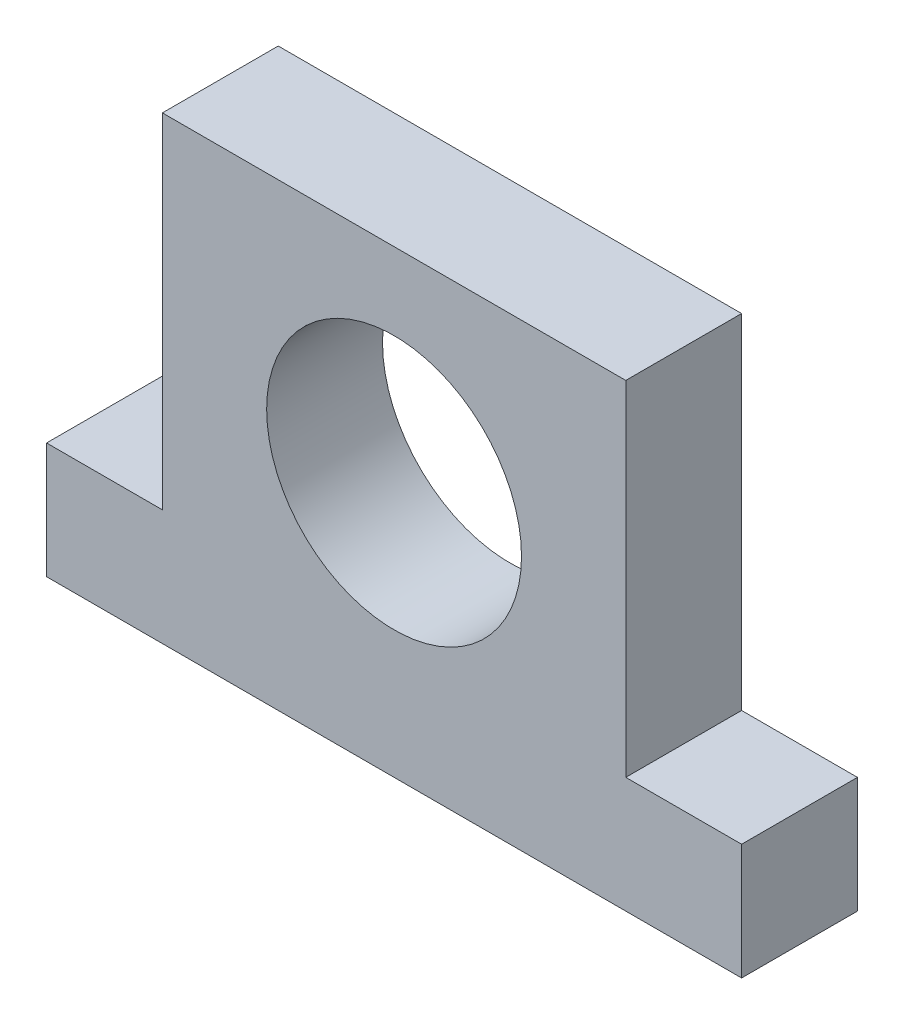
ISO-10303-21;
HEADER;
FILE_DESCRIPTION(('STEP AP214'),'2;1');
FILE_NAME('part.step','',(''),(''),'','','');
FILE_SCHEMA(('AUTOMOTIVE_DESIGN { 1 0 10303 214 1 1 1 1 }'));
ENDSEC;
DATA;
#1=APPLICATION_CONTEXT('core data for automotive mechanical design processes');
#2=APPLICATION_PROTOCOL_DEFINITION('international standard','automotive_design',2000,#1);
#3=PRODUCT_CONTEXT('',#1,'mechanical');
#4=PRODUCT('Part','Part','',(#3));
#5=PRODUCT_RELATED_PRODUCT_CATEGORY('part','',(#4));
#6=PRODUCT_DEFINITION_FORMATION('','',#4);
#7=PRODUCT_DEFINITION_CONTEXT('part definition',#1,'design');
#8=PRODUCT_DEFINITION('design','',#6,#7);
#9=PRODUCT_DEFINITION_SHAPE('','',#8);
#10=(LENGTH_UNIT() NAMED_UNIT(*) SI_UNIT(.MILLI.,.METRE.));
#11=(NAMED_UNIT(*) PLANE_ANGLE_UNIT() SI_UNIT($,.RADIAN.));
#12=(NAMED_UNIT(*) SI_UNIT($,.STERADIAN.) SOLID_ANGLE_UNIT());
#13=UNCERTAINTY_MEASURE_WITH_UNIT(LENGTH_MEASURE(1.E-05),#10,'distance_accuracy_value','');
#14=(GEOMETRIC_REPRESENTATION_CONTEXT(3) GLOBAL_UNCERTAINTY_ASSIGNED_CONTEXT((#13)) GLOBAL_UNIT_ASSIGNED_CONTEXT((#10,
#11,#12)) REPRESENTATION_CONTEXT('',''));
#15=CARTESIAN_POINT('',(0.,0.,0.));
#16=DIRECTION('',(0.,0.,1.));
#17=DIRECTION('',(1.,0.,0.));
#18=AXIS2_PLACEMENT_3D('',#15,#16,#17);
#19=CARTESIAN_POINT('',(0.,0.,10.));
#20=DIRECTION('',(0.,0.,-1.));
#21=DIRECTION('',(-1.,0.,0.));
#22=AXIS2_PLACEMENT_3D('',#19,#20,#21);
#23=PLANE('',#22);
#24=DIRECTION('',(0.,-1.,0.));
#25=VECTOR('',#24,1.);
#26=CARTESIAN_POINT('',(0.,-10.,10.));
#27=LINE('',#26,#25);
#28=CARTESIAN_POINT('',(0.,0.,10.));
#29=VERTEX_POINT('',#28);
#30=CARTESIAN_POINT('',(0.,-10.,10.));
#31=VERTEX_POINT('',#30);
#32=EDGE_CURVE('E145',#29,#31,#27,.T.);
#33=ORIENTED_EDGE('',*,*,#32,.T.);
#34=DIRECTION('',(1.,0.,0.));
#35=VECTOR('',#34,1.);
#36=CARTESIAN_POINT('',(60.,-10.,10.));
#37=LINE('',#36,#35);
#38=CARTESIAN_POINT('',(60.,-10.,10.));
#39=VERTEX_POINT('',#38);
#40=EDGE_CURVE('E93',#31,#39,#37,.T.);
#41=ORIENTED_EDGE('',*,*,#40,.T.);
#42=DIRECTION('',(0.,1.,0.));
#43=VECTOR('',#42,1.);
#44=CARTESIAN_POINT('',(60.,0.,10.));
#45=LINE('',#44,#43);
#46=CARTESIAN_POINT('',(60.,0.,10.));
#47=VERTEX_POINT('',#46);
#48=EDGE_CURVE('E160',#39,#47,#45,.T.);
#49=ORIENTED_EDGE('',*,*,#48,.T.);
#50=DIRECTION('',(-1.,0.,0.));
#51=VECTOR('',#50,1.);
#52=CARTESIAN_POINT('',(50.,0.,10.));
#53=LINE('',#52,#51);
#54=CARTESIAN_POINT('',(50.,0.,10.));
#55=VERTEX_POINT('',#54);
#56=EDGE_CURVE('E173',#47,#55,#53,.T.);
#57=ORIENTED_EDGE('',*,*,#56,.T.);
#58=DIRECTION('',(0.,1.,0.));
#59=VECTOR('',#58,1.);
#60=CARTESIAN_POINT('',(50.,29.6764798214082,10.));
#61=LINE('',#60,#59);
#62=CARTESIAN_POINT('',(50.,29.6764798214082,10.));
#63=VERTEX_POINT('',#62);
#64=EDGE_CURVE('E112',#55,#63,#61,.T.);
#65=ORIENTED_EDGE('',*,*,#64,.T.);
#66=DIRECTION('',(-1.,0.,0.));
#67=VECTOR('',#66,1.);
#68=CARTESIAN_POINT('',(10.,29.6764798214082,10.));
#69=LINE('',#68,#67);
#70=CARTESIAN_POINT('',(10.,29.6764798214082,10.));
#71=VERTEX_POINT('',#70);
#72=EDGE_CURVE('E106',#63,#71,#69,.T.);
#73=ORIENTED_EDGE('',*,*,#72,.T.);
#74=DIRECTION('',(0.,-1.,0.));
#75=VECTOR('',#74,1.);
#76=CARTESIAN_POINT('',(10.,0.,10.));
#77=LINE('',#76,#75);
#78=CARTESIAN_POINT('',(10.,0.,10.));
#79=VERTEX_POINT('',#78);
#80=EDGE_CURVE('E110',#71,#79,#77,.T.);
#81=ORIENTED_EDGE('',*,*,#80,.T.);
#82=DIRECTION('',(-1.,0.,0.));
#83=VECTOR('',#82,1.);
#84=CARTESIAN_POINT('',(0.,0.,10.));
#85=LINE('',#84,#83);
#86=EDGE_CURVE('E50',#79,#29,#85,.T.);
#87=ORIENTED_EDGE('',*,*,#86,.T.);
#88=EDGE_LOOP('',(#33,#41,#49,#57,#65,#73,#81,#87));
#89=FACE_BOUND('',#88,.T.);
#90=CARTESIAN_POINT('',(30.,12.0263285573637,10.));
#91=DIRECTION('',(0.,0.,1.));
#92=DIRECTION('',(1.,0.,0.));
#93=AXIS2_PLACEMENT_3D('',#90,#91,#92);
#94=CIRCLE('',#93,11.);
#95=CARTESIAN_POINT('',(41.,12.0263285573637,10.));
#96=VERTEX_POINT('',#95);
#97=EDGE_CURVE('E134',#96,#96,#94,.T.);
#98=ORIENTED_EDGE('',*,*,#97,.F.);
#99=EDGE_LOOP('',(#98));
#100=FACE_BOUND('',#99,.T.);
#101=ADVANCED_FACE('F33',(#89,#100),#23,.F.);
#102=CARTESIAN_POINT('',(0.,0.,0.));
#103=DIRECTION('',(0.,0.,-1.));
#104=DIRECTION('',(-1.,0.,0.));
#105=AXIS2_PLACEMENT_3D('',#102,#103,#104);
#106=PLANE('',#105);
#107=DIRECTION('',(0.,-1.,0.));
#108=VECTOR('',#107,1.);
#109=CARTESIAN_POINT('',(0.,-10.,0.));
#110=LINE('',#109,#108);
#111=CARTESIAN_POINT('',(0.,0.,0.));
#112=VERTEX_POINT('',#111);
#113=CARTESIAN_POINT('',(0.,-10.,0.));
#114=VERTEX_POINT('',#113);
#115=EDGE_CURVE('E130',#112,#114,#110,.T.);
#116=ORIENTED_EDGE('',*,*,#115,.F.);
#117=DIRECTION('',(-1.,0.,0.));
#118=VECTOR('',#117,1.);
#119=CARTESIAN_POINT('',(0.,0.,0.));
#120=LINE('',#119,#118);
#121=CARTESIAN_POINT('',(10.,0.,0.));
#122=VERTEX_POINT('',#121);
#123=EDGE_CURVE('E85',#122,#112,#120,.T.);
#124=ORIENTED_EDGE('',*,*,#123,.F.);
#125=DIRECTION('',(0.,-1.,0.));
#126=VECTOR('',#125,1.);
#127=CARTESIAN_POINT('',(10.,0.,0.));
#128=LINE('',#127,#126);
#129=CARTESIAN_POINT('',(10.,29.6764798214082,0.));
#130=VERTEX_POINT('',#129);
#131=EDGE_CURVE('E79',#130,#122,#128,.T.);
#132=ORIENTED_EDGE('',*,*,#131,.F.);
#133=DIRECTION('',(-1.,0.,0.));
#134=VECTOR('',#133,1.);
#135=CARTESIAN_POINT('',(10.,29.6764798214082,0.));
#136=LINE('',#135,#134);
#137=CARTESIAN_POINT('',(50.,29.6764798214082,0.));
#138=VERTEX_POINT('',#137);
#139=EDGE_CURVE('E120',#138,#130,#136,.T.);
#140=ORIENTED_EDGE('',*,*,#139,.F.);
#141=DIRECTION('',(0.,1.,0.));
#142=VECTOR('',#141,1.);
#143=CARTESIAN_POINT('',(50.,29.6764798214082,0.));
#144=LINE('',#143,#142);
#145=CARTESIAN_POINT('',(50.,0.,0.));
#146=VERTEX_POINT('',#145);
#147=EDGE_CURVE('E140',#146,#138,#144,.T.);
#148=ORIENTED_EDGE('',*,*,#147,.F.);
#149=DIRECTION('',(-1.,0.,0.));
#150=VECTOR('',#149,1.);
#151=CARTESIAN_POINT('',(50.,0.,0.));
#152=LINE('',#151,#150);
#153=CARTESIAN_POINT('',(60.,0.,0.));
#154=VERTEX_POINT('',#153);
#155=EDGE_CURVE('E138',#154,#146,#152,.T.);
#156=ORIENTED_EDGE('',*,*,#155,.F.);
#157=DIRECTION('',(0.,1.,0.));
#158=VECTOR('',#157,1.);
#159=CARTESIAN_POINT('',(60.,0.,0.));
#160=LINE('',#159,#158);
#161=CARTESIAN_POINT('',(60.,-10.,0.));
#162=VERTEX_POINT('',#161);
#163=EDGE_CURVE('E136',#162,#154,#160,.T.);
#164=ORIENTED_EDGE('',*,*,#163,.F.);
#165=DIRECTION('',(1.,0.,0.));
#166=VECTOR('',#165,1.);
#167=CARTESIAN_POINT('',(60.,-10.,0.));
#168=LINE('',#167,#166);
#169=EDGE_CURVE('E133',#114,#162,#168,.T.);
#170=ORIENTED_EDGE('',*,*,#169,.F.);
#171=EDGE_LOOP('',(#116,#124,#132,#140,#148,#156,#164,#170));
#172=FACE_BOUND('',#171,.T.);
#173=CARTESIAN_POINT('',(30.,12.0263285573637,0.));
#174=DIRECTION('',(0.,0.,1.));
#175=DIRECTION('',(1.,0.,0.));
#176=AXIS2_PLACEMENT_3D('',#173,#174,#175);
#177=CIRCLE('',#176,11.);
#178=CARTESIAN_POINT('',(41.,12.0263285573637,0.));
#179=VERTEX_POINT('',#178);
#180=EDGE_CURVE('E179',#179,#179,#177,.T.);
#181=ORIENTED_EDGE('',*,*,#180,.T.);
#182=EDGE_LOOP('',(#181));
#183=FACE_BOUND('',#182,.T.);
#184=ADVANCED_FACE('F164',(#172,#183),#106,.T.);
#185=CARTESIAN_POINT('',(0.,-10.,10.));
#186=DIRECTION('',(1.,0.,0.));
#187=DIRECTION('',(0.,1.,0.));
#188=AXIS2_PLACEMENT_3D('',#185,#186,#187);
#189=PLANE('',#188);
#190=ORIENTED_EDGE('',*,*,#115,.T.);
#191=DIRECTION('',(0.,0.,-1.));
#192=VECTOR('',#191,1.);
#193=CARTESIAN_POINT('',(0.,-10.,10.));
#194=LINE('',#193,#192);
#195=EDGE_CURVE('E11',#31,#114,#194,.T.);
#196=ORIENTED_EDGE('',*,*,#195,.F.);
#197=ORIENTED_EDGE('',*,*,#32,.F.);
#198=DIRECTION('',(0.,0.,-1.));
#199=VECTOR('',#198,1.);
#200=CARTESIAN_POINT('',(0.,0.,10.));
#201=LINE('',#200,#199);
#202=EDGE_CURVE('E126',#29,#112,#201,.T.);
#203=ORIENTED_EDGE('',*,*,#202,.T.);
#204=EDGE_LOOP('',(#190,#196,#197,#203));
#205=FACE_BOUND('',#204,.T.);
#206=ADVANCED_FACE('F35',(#205),#189,.F.);
#207=CARTESIAN_POINT('',(60.,-10.,10.));
#208=DIRECTION('',(0.,1.,0.));
#209=DIRECTION('',(-1.,0.,0.));
#210=AXIS2_PLACEMENT_3D('',#207,#208,#209);
#211=PLANE('',#210);
#212=ORIENTED_EDGE('',*,*,#169,.T.);
#213=DIRECTION('',(0.,0.,-1.));
#214=VECTOR('',#213,1.);
#215=CARTESIAN_POINT('',(60.,-10.,10.));
#216=LINE('',#215,#214);
#217=EDGE_CURVE('E42',#39,#162,#216,.T.);
#218=ORIENTED_EDGE('',*,*,#217,.F.);
#219=ORIENTED_EDGE('',*,*,#40,.F.);
#220=ORIENTED_EDGE('',*,*,#195,.T.);
#221=EDGE_LOOP('',(#212,#218,#219,#220));
#222=FACE_BOUND('',#221,.T.);
#223=ADVANCED_FACE('F207',(#222),#211,.F.);
#224=CARTESIAN_POINT('',(60.,0.,10.));
#225=DIRECTION('',(-1.,0.,0.));
#226=DIRECTION('',(0.,-1.,0.));
#227=AXIS2_PLACEMENT_3D('',#224,#225,#226);
#228=PLANE('',#227);
#229=ORIENTED_EDGE('',*,*,#163,.T.);
#230=DIRECTION('',(0.,0.,-1.));
#231=VECTOR('',#230,1.);
#232=CARTESIAN_POINT('',(60.,0.,10.));
#233=LINE('',#232,#231);
#234=EDGE_CURVE('E152',#47,#154,#233,.T.);
#235=ORIENTED_EDGE('',*,*,#234,.F.);
#236=ORIENTED_EDGE('',*,*,#48,.F.);
#237=ORIENTED_EDGE('',*,*,#217,.T.);
#238=EDGE_LOOP('',(#229,#235,#236,#237));
#239=FACE_BOUND('',#238,.T.);
#240=ADVANCED_FACE('F158',(#239),#228,.F.);
#241=CARTESIAN_POINT('',(50.,0.,10.));
#242=DIRECTION('',(0.,-1.,0.));
#243=DIRECTION('',(0.,0.,-1.));
#244=AXIS2_PLACEMENT_3D('',#241,#242,#243);
#245=PLANE('',#244);
#246=ORIENTED_EDGE('',*,*,#155,.T.);
#247=DIRECTION('',(0.,0.,-1.));
#248=VECTOR('',#247,1.);
#249=CARTESIAN_POINT('',(50.,0.,10.));
#250=LINE('',#249,#248);
#251=EDGE_CURVE('E149',#55,#146,#250,.T.);
#252=ORIENTED_EDGE('',*,*,#251,.F.);
#253=ORIENTED_EDGE('',*,*,#56,.F.);
#254=ORIENTED_EDGE('',*,*,#234,.T.);
#255=EDGE_LOOP('',(#246,#252,#253,#254));
#256=FACE_BOUND('',#255,.T.);
#257=ADVANCED_FACE('F169',(#256),#245,.F.);
#258=CARTESIAN_POINT('',(50.,29.6764798214082,10.));
#259=DIRECTION('',(-1.,0.,0.));
#260=DIRECTION('',(0.,0.,1.));
#261=AXIS2_PLACEMENT_3D('',#258,#259,#260);
#262=PLANE('',#261);
#263=ORIENTED_EDGE('',*,*,#147,.T.);
#264=DIRECTION('',(0.,0.,-1.));
#265=VECTOR('',#264,1.);
#266=CARTESIAN_POINT('',(50.,29.6764798214082,10.));
#267=LINE('',#266,#265);
#268=EDGE_CURVE('E121',#63,#138,#267,.T.);
#269=ORIENTED_EDGE('',*,*,#268,.F.);
#270=ORIENTED_EDGE('',*,*,#64,.F.);
#271=ORIENTED_EDGE('',*,*,#251,.T.);
#272=EDGE_LOOP('',(#263,#269,#270,#271));
#273=FACE_BOUND('',#272,.T.);
#274=ADVANCED_FACE('F172',(#273),#262,.F.);
#275=CARTESIAN_POINT('',(10.,29.6764798214082,10.));
#276=DIRECTION('',(0.,-1.,0.));
#277=DIRECTION('',(0.,0.,-1.));
#278=AXIS2_PLACEMENT_3D('',#275,#276,#277);
#279=PLANE('',#278);
#280=ORIENTED_EDGE('',*,*,#139,.T.);
#281=DIRECTION('',(0.,0.,-1.));
#282=VECTOR('',#281,1.);
#283=CARTESIAN_POINT('',(10.,29.6764798214082,10.));
#284=LINE('',#283,#282);
#285=EDGE_CURVE('E117',#71,#130,#284,.T.);
#286=ORIENTED_EDGE('',*,*,#285,.F.);
#287=ORIENTED_EDGE('',*,*,#72,.F.);
#288=ORIENTED_EDGE('',*,*,#268,.T.);
#289=EDGE_LOOP('',(#280,#286,#287,#288));
#290=FACE_BOUND('',#289,.T.);
#291=ADVANCED_FACE('F118',(#290),#279,.F.);
#292=CARTESIAN_POINT('',(10.,0.,10.));
#293=DIRECTION('',(1.,0.,0.));
#294=DIRECTION('',(0.,0.,-1.));
#295=AXIS2_PLACEMENT_3D('',#292,#293,#294);
#296=PLANE('',#295);
#297=ORIENTED_EDGE('',*,*,#131,.T.);
#298=DIRECTION('',(0.,0.,-1.));
#299=VECTOR('',#298,1.);
#300=CARTESIAN_POINT('',(10.,0.,10.));
#301=LINE('',#300,#299);
#302=EDGE_CURVE('E122',#79,#122,#301,.T.);
#303=ORIENTED_EDGE('',*,*,#302,.F.);
#304=ORIENTED_EDGE('',*,*,#80,.F.);
#305=ORIENTED_EDGE('',*,*,#285,.T.);
#306=EDGE_LOOP('',(#297,#303,#304,#305));
#307=FACE_BOUND('',#306,.T.);
#308=ADVANCED_FACE('F124',(#307),#296,.F.);
#309=CARTESIAN_POINT('',(0.,0.,10.));
#310=DIRECTION('',(0.,-1.,0.));
#311=DIRECTION('',(0.,0.,-1.));
#312=AXIS2_PLACEMENT_3D('',#309,#310,#311);
#313=PLANE('',#312);
#314=ORIENTED_EDGE('',*,*,#123,.T.);
#315=ORIENTED_EDGE('',*,*,#202,.F.);
#316=ORIENTED_EDGE('',*,*,#86,.F.);
#317=ORIENTED_EDGE('',*,*,#302,.T.);
#318=EDGE_LOOP('',(#314,#315,#316,#317));
#319=FACE_BOUND('',#318,.T.);
#320=ADVANCED_FACE('F195',(#319),#313,.F.);
#321=CARTESIAN_POINT('',(30.,12.0263285573637,10.));
#322=DIRECTION('',(0.,0.,-1.));
#323=DIRECTION('',(-1.,0.,0.));
#324=AXIS2_PLACEMENT_3D('',#321,#322,#323);
#325=CYLINDRICAL_SURFACE('',#324,11.);
#326=ORIENTED_EDGE('',*,*,#97,.T.);
#327=EDGE_LOOP('',(#326));
#328=FACE_BOUND('',#327,.T.);
#329=ORIENTED_EDGE('',*,*,#180,.F.);
#330=EDGE_LOOP('',(#329));
#331=FACE_BOUND('',#330,.T.);
#332=ADVANCED_FACE('F185',(#328,#331),#325,.F.);
#333=CLOSED_SHELL('',(#101,#184,#206,#223,#240,#257,#274,#291,#308,#320,#332));
#334=MANIFOLD_SOLID_BREP('B2',#333);
#335=ADVANCED_BREP_SHAPE_REPRESENTATION('',(#18,#334),#14);
#336=SHAPE_DEFINITION_REPRESENTATION(#9,#335);
ENDSEC;
END-ISO-10303-21;
